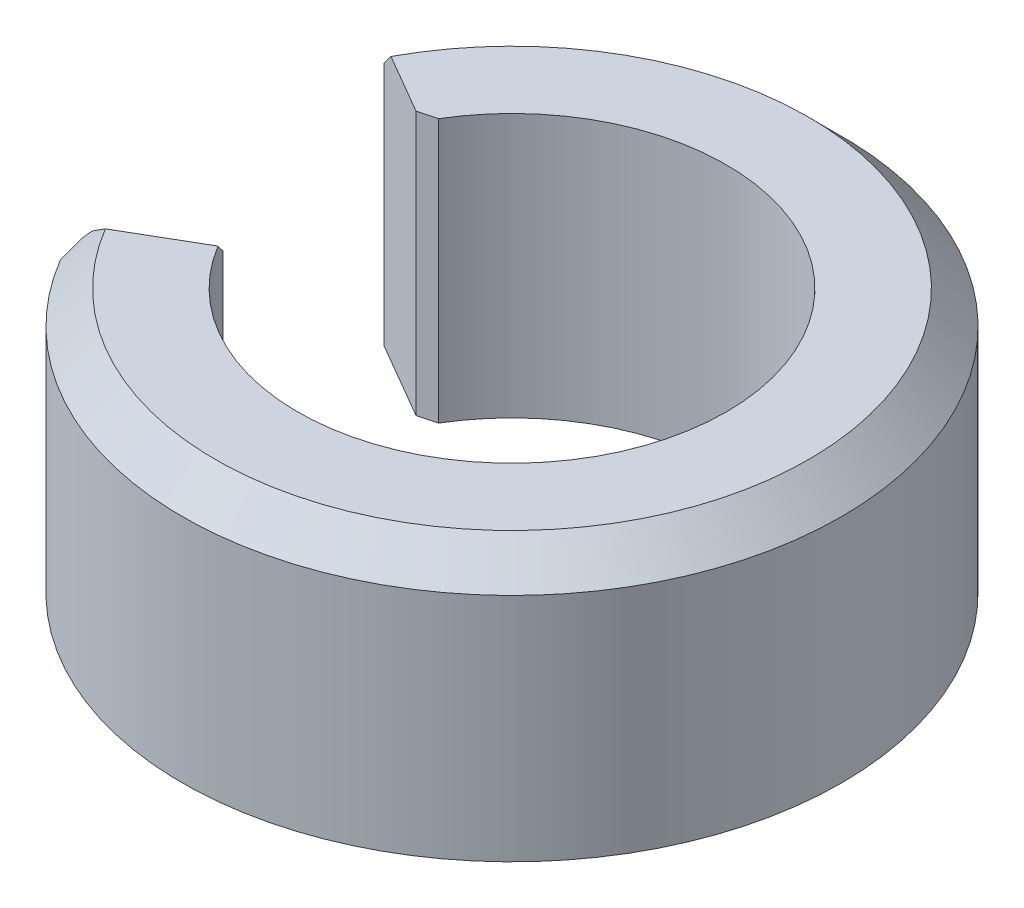
ISO-10303-21;
HEADER;
FILE_DESCRIPTION(('STEP AP214'),'2;1');
FILE_NAME('part.step','',(''),(''),'','','');
FILE_SCHEMA(('AUTOMOTIVE_DESIGN { 1 0 10303 214 1 1 1 1 }'));
ENDSEC;
DATA;
#1=APPLICATION_CONTEXT('core data for automotive mechanical design processes');
#2=APPLICATION_PROTOCOL_DEFINITION('international standard','automotive_design',2000,#1);
#3=PRODUCT_CONTEXT('',#1,'mechanical');
#4=PRODUCT('Part','Part','',(#3));
#5=PRODUCT_RELATED_PRODUCT_CATEGORY('part','',(#4));
#6=PRODUCT_DEFINITION_FORMATION('','',#4);
#7=PRODUCT_DEFINITION_CONTEXT('part definition',#1,'design');
#8=PRODUCT_DEFINITION('design','',#6,#7);
#9=PRODUCT_DEFINITION_SHAPE('','',#8);
#10=(LENGTH_UNIT() NAMED_UNIT(*) SI_UNIT(.MILLI.,.METRE.));
#11=(NAMED_UNIT(*) PLANE_ANGLE_UNIT() SI_UNIT($,.RADIAN.));
#12=(NAMED_UNIT(*) SI_UNIT($,.STERADIAN.) SOLID_ANGLE_UNIT());
#13=UNCERTAINTY_MEASURE_WITH_UNIT(LENGTH_MEASURE(1.E-05),#10,'distance_accuracy_value','');
#14=(GEOMETRIC_REPRESENTATION_CONTEXT(3) GLOBAL_UNCERTAINTY_ASSIGNED_CONTEXT((#13)) GLOBAL_UNIT_ASSIGNED_CONTEXT((#10,
#11,#12)) REPRESENTATION_CONTEXT('',''));
#15=CARTESIAN_POINT('',(0.,0.,0.));
#16=DIRECTION('',(0.,0.,1.));
#17=DIRECTION('',(1.,0.,0.));
#18=AXIS2_PLACEMENT_3D('',#15,#16,#17);
#19=CARTESIAN_POINT('',(0.,4.,0.));
#20=DIRECTION('',(0.,-1.,0.));
#21=DIRECTION('',(0.,0.,-1.));
#22=AXIS2_PLACEMENT_3D('',#19,#20,#21);
#23=CYLINDRICAL_SURFACE('',#22,3.25);
#24=DIRECTION('',(0.,-1.,0.));
#25=VECTOR('',#24,1.);
#26=CARTESIAN_POINT('',(-2.8831406486677,4.,1.5));
#27=LINE('',#26,#25);
#28=CARTESIAN_POINT('',(-2.8831406486677,3.8,1.5));
#29=VERTEX_POINT('',#28);
#30=CARTESIAN_POINT('',(-2.8831406486677,0.,1.5));
#31=VERTEX_POINT('',#30);
#32=EDGE_CURVE('E120',#29,#31,#27,.T.);
#33=ORIENTED_EDGE('',*,*,#32,.F.);
#34=CARTESIAN_POINT('',(0.,3.9513832198583,0.));
#35=DIRECTION('',(0.355221508707248,-0.707106781186547,0.611406313143516));
#36=DIRECTION('',(-0.355221508707247,-0.707106781186548,-0.611406313143515));
#37=AXIS2_PLACEMENT_3D('',#34,#35,#36);
#38=ELLIPSE('',#37,4.59619407771256,3.25);
#39=CARTESIAN_POINT('',(-2.78540456174295,4.,1.67452125320091));
#40=VERTEX_POINT('',#39);
#41=EDGE_CURVE('E157',#29,#40,#38,.F.);
#42=ORIENTED_EDGE('',*,*,#41,.T.);
#43=CARTESIAN_POINT('',(0.,4.,0.));
#44=DIRECTION('',(0.,1.,0.));
#45=DIRECTION('',(0.,0.,1.));
#46=AXIS2_PLACEMENT_3D('',#43,#44,#45);
#47=CIRCLE('',#46,3.25);
#48=CARTESIAN_POINT('',(-2.7870574838442,4.,-1.67176869863867));
#49=VERTEX_POINT('',#48);
#50=EDGE_CURVE('E152',#40,#49,#47,.T.);
#51=ORIENTED_EDGE('',*,*,#50,.T.);
#52=DIRECTION('',(0.,-1.,0.));
#53=VECTOR('',#52,1.);
#54=CARTESIAN_POINT('',(-2.7870574838442,4.,-1.67176869863867));
#55=LINE('',#54,#53);
#56=CARTESIAN_POINT('',(-2.7870574838442,0.,-1.67176869863867));
#57=VERTEX_POINT('',#56);
#58=EDGE_CURVE('E143',#49,#57,#55,.T.);
#59=ORIENTED_EDGE('',*,*,#58,.T.);
#60=CARTESIAN_POINT('',(0.,0.,0.));
#61=DIRECTION('',(0.,1.,0.));
#62=DIRECTION('',(0.,0.,1.));
#63=AXIS2_PLACEMENT_3D('',#60,#61,#62);
#64=CIRCLE('',#63,3.25);
#65=EDGE_CURVE('E135',#31,#57,#64,.T.);
#66=ORIENTED_EDGE('',*,*,#65,.F.);
#67=EDGE_LOOP('',(#33,#42,#51,#59,#66));
#68=FACE_BOUND('',#67,.T.);
#69=ADVANCED_FACE('F43',(#68),#23,.F.);
#70=CARTESIAN_POINT('',(-0.076048734337961,4.,-0.130894878663227));
#71=DIRECTION('',(-0.502359075260422,0.,-0.864659100168092));
#72=DIRECTION('',(-0.864659100168091,0.,0.502359075260422));
#73=AXIS2_PLACEMENT_3D('',#70,#71,#72);
#74=PLANE('',#73);
#75=DIRECTION('',(0.,1.,0.));
#76=VECTOR('',#75,1.);
#77=CARTESIAN_POINT('',(-4.22443043201248,4.,2.27927716840816));
#78=LINE('',#77,#76);
#79=CARTESIAN_POINT('',(-4.22443043201248,0.,2.27927716840816));
#80=VERTEX_POINT('',#79);
#81=CARTESIAN_POINT('',(-4.22443043201248,3.69990449206061,2.27927716840816));
#82=VERTEX_POINT('',#81);
#83=EDGE_CURVE('E128',#80,#82,#78,.T.);
#84=ORIENTED_EDGE('',*,*,#83,.T.);
#85=CARTESIAN_POINT('',(-4.22443043201248,3.69990449206061,2.27927716840816));
#86=CARTESIAN_POINT('',(-4.20999842873637,3.71658716612793,2.27089230572813));
#87=CARTESIAN_POINT('',(-4.19556638682498,3.73326979548987,2.26250742060137));
#88=CARTESIAN_POINT('',(-4.16670222573165,3.766634964803,2.24573760545434));
#89=CARTESIAN_POINT('',(-4.15227010654972,3.78331750475419,2.23735267543409));
#90=CARTESIAN_POINT('',(-4.13783794873251,3.8,2.22896772296709));
#91=B_SPLINE_CURVE_WITH_KNOTS('',3,(#85,#86,#87,#88,#89,#90),.UNSPECIFIED.,.F.,.F.,(4,2,4),(0.,
0.0707962025305125,0.141592405061035),.UNSPECIFIED.);
#92=CARTESIAN_POINT('',(-4.13783794873251,3.8,2.22896772296709));
#93=VERTEX_POINT('',#92);
#94=EDGE_CURVE('E58',#82,#93,#91,.T.);
#95=ORIENTED_EDGE('',*,*,#94,.T.);
#96=DIRECTION('',(0.864659100168091,0.,-0.502359075260422));
#97=VECTOR('',#96,1.);
#98=CARTESIAN_POINT('',(-0.076048734337961,3.8,-0.130894878663227));
#99=LINE('',#98,#97);
#100=EDGE_CURVE('E124',#93,#29,#99,.T.);
#101=ORIENTED_EDGE('',*,*,#100,.T.);
#102=ORIENTED_EDGE('',*,*,#32,.T.);
#103=DIRECTION('',(0.864659100168091,0.,-0.502359075260422));
#104=VECTOR('',#103,1.);
#105=CARTESIAN_POINT('',(-0.076048734337961,0.,-0.130894878663227));
#106=LINE('',#105,#104);
#107=EDGE_CURVE('E123',#80,#31,#106,.T.);
#108=ORIENTED_EDGE('',*,*,#107,.F.);
#109=EDGE_LOOP('',(#84,#95,#101,#102,#108));
#110=FACE_BOUND('',#109,.T.);
#111=ADVANCED_FACE('F122',(#110),#74,.T.);
#112=CARTESIAN_POINT('',(0.,4.,0.));
#113=DIRECTION('',(0.,-1.,0.));
#114=DIRECTION('',(0.,0.,-1.));
#115=AXIS2_PLACEMENT_3D('',#112,#113,#114);
#116=CYLINDRICAL_SURFACE('',#115,5.);
#117=DIRECTION('',(0.,-1.,0.));
#118=VECTOR('',#117,1.);
#119=CARTESIAN_POINT('',(-4.30061913286326,4.,-2.55042644944928));
#120=LINE('',#119,#118);
#121=CARTESIAN_POINT('',(-4.30061913286326,0.,-2.55042644944928));
#122=VERTEX_POINT('',#121);
#123=CARTESIAN_POINT('',(-4.30061913286326,3.49999999999999,-2.55042644944928));
#124=VERTEX_POINT('',#123);
#125=EDGE_CURVE('E164',#122,#124,#120,.F.);
#126=ORIENTED_EDGE('',*,*,#125,.T.);
#127=CARTESIAN_POINT('',(0.,3.49999999999999,0.));
#128=DIRECTION('',(0.,1.,0.));
#129=DIRECTION('',(0.,0.,1.));
#130=AXIS2_PLACEMENT_3D('',#127,#128,#129);
#131=CIRCLE('',#130,5.);
#132=CARTESIAN_POINT('',(-4.29762794941674,3.49999999999999,2.55546356037258));
#133=VERTEX_POINT('',#132);
#134=EDGE_CURVE('E221',#124,#133,#131,.F.);
#135=ORIENTED_EDGE('',*,*,#134,.T.);
#136=DIRECTION('',(0.,-1.,0.));
#137=VECTOR('',#136,1.);
#138=CARTESIAN_POINT('',(-4.29762794941674,4.,2.55546356037258));
#139=LINE('',#138,#137);
#140=CARTESIAN_POINT('',(-4.29762794941674,0.,2.55546356037258));
#141=VERTEX_POINT('',#140);
#142=EDGE_CURVE('E167',#133,#141,#139,.T.);
#143=ORIENTED_EDGE('',*,*,#142,.T.);
#144=CARTESIAN_POINT('',(0.,0.,0.));
#145=DIRECTION('',(0.,1.,0.));
#146=DIRECTION('',(0.,0.,1.));
#147=AXIS2_PLACEMENT_3D('',#144,#145,#146);
#148=CIRCLE('',#147,5.);
#149=EDGE_CURVE('E138',#141,#122,#148,.T.);
#150=ORIENTED_EDGE('',*,*,#149,.T.);
#151=EDGE_LOOP('',(#126,#135,#143,#150));
#152=FACE_BOUND('',#151,.T.);
#153=ADVANCED_FACE('F202',(#152),#116,.T.);
#154=CARTESIAN_POINT('',(-0.0760487343379624,4.,0.130894878663229));
#155=DIRECTION('',(0.502359075260422,0.,-0.864659100168091));
#156=DIRECTION('',(-0.864659100168091,0.,-0.502359075260422));
#157=AXIS2_PLACEMENT_3D('',#154,#155,#156);
#158=PLANE('',#157);
#159=DIRECTION('',(0.864659100168091,0.,0.502359075260422));
#160=VECTOR('',#159,1.);
#161=CARTESIAN_POINT('',(-0.0760487343379624,4.,0.130894878663229));
#162=LINE('',#161,#160);
#163=CARTESIAN_POINT('',(-3.96481236313895,4.,-2.12844143097725));
#164=VERTEX_POINT('',#163);
#165=CARTESIAN_POINT('',(-3.05607246870132,4.,-1.60047181505208));
#166=VERTEX_POINT('',#165);
#167=EDGE_CURVE('E129',#164,#166,#162,.T.);
#168=ORIENTED_EDGE('',*,*,#167,.F.);
#169=CARTESIAN_POINT('',(-3.96481236313895,4.,-2.12844143097725));
#170=CARTESIAN_POINT('',(-4.00716881715181,3.95104136839675,-2.15305014563147));
#171=CARTESIAN_POINT('',(-4.04952491541295,3.90208232513896,-2.17765865359717));
#172=CARTESIAN_POINT('',(-4.13423640043159,3.80416341531452,-2.22687525615143));
#173=CARTESIAN_POINT('',(-4.17659178718909,3.75520354874788,-2.25148335073999));
#174=CARTESIAN_POINT('',(-4.21894681819486,3.7062432705267,-2.27609123864004));
#175=B_SPLINE_CURVE_WITH_KNOTS('',3,(#169,#170,#171,#172,#173,#174),.UNSPECIFIED.,.F.,.F.,(4,2,
4),(0.,0.207772593881651,0.415545187762374),.UNSPECIFIED.);
#176=CARTESIAN_POINT('',(-4.21894681819486,3.7062432705267,-2.27609123864004));
#177=VERTEX_POINT('',#176);
#178=EDGE_CURVE('E182',#164,#177,#175,.T.);
#179=ORIENTED_EDGE('',*,*,#178,.T.);
#180=DIRECTION('',(0.,-1.,0.));
#181=VECTOR('',#180,1.);
#182=CARTESIAN_POINT('',(-4.21894681819486,4.,-2.27609123864004));
#183=LINE('',#182,#181);
#184=CARTESIAN_POINT('',(-4.21894681819486,0.,-2.27609123864004));
#185=VERTEX_POINT('',#184);
#186=EDGE_CURVE('E177',#177,#185,#183,.T.);
#187=ORIENTED_EDGE('',*,*,#186,.T.);
#188=DIRECTION('',(0.864659100168091,0.,0.502359075260422));
#189=VECTOR('',#188,1.);
#190=CARTESIAN_POINT('',(-0.0760487343379624,0.,0.130894878663229));
#191=LINE('',#190,#189);
#192=CARTESIAN_POINT('',(-3.05607246870132,0.,-1.60047181505208));
#193=VERTEX_POINT('',#192);
#194=EDGE_CURVE('E150',#185,#193,#191,.T.);
#195=ORIENTED_EDGE('',*,*,#194,.T.);
#196=DIRECTION('',(0.,1.,0.));
#197=VECTOR('',#196,1.);
#198=CARTESIAN_POINT('',(-3.05607246870132,4.,-1.60047181505208));
#199=LINE('',#198,#197);
#200=EDGE_CURVE('E174',#193,#166,#199,.T.);
#201=ORIENTED_EDGE('',*,*,#200,.T.);
#202=EDGE_LOOP('',(#168,#179,#187,#195,#201));
#203=FACE_BOUND('',#202,.T.);
#204=ADVANCED_FACE('F196',(#203),#158,.F.);
#205=CARTESIAN_POINT('',(0.,4.,0.));
#206=DIRECTION('',(0.,1.,0.));
#207=DIRECTION('',(0.,0.,1.));
#208=AXIS2_PLACEMENT_3D('',#205,#206,#207);
#209=PLANE('',#208);
#210=DIRECTION('',(-0.864659100168091,0.,0.502359075260422));
#211=VECTOR('',#210,1.);
#212=CARTESIAN_POINT('',(0.0244230807141226,4.,0.0420369413703904));
#213=LINE('',#212,#211);
#214=CARTESIAN_POINT('',(-3.86631578555613,4.,2.30252084602061));
#215=VERTEX_POINT('',#214);
#216=EDGE_CURVE('E161',#40,#215,#213,.T.);
#217=ORIENTED_EDGE('',*,*,#216,.T.);
#218=CARTESIAN_POINT('',(0.,4.,0.));
#219=DIRECTION('',(0.,1.,0.));
#220=DIRECTION('',(0.,0.,1.));
#221=AXIS2_PLACEMENT_3D('',#218,#219,#220);
#222=CIRCLE('',#221,4.5);
#223=EDGE_CURVE('E179',#215,#164,#222,.T.);
#224=ORIENTED_EDGE('',*,*,#223,.T.);
#225=ORIENTED_EDGE('',*,*,#167,.T.);
#226=DIRECTION('',(-0.966627821850764,0.,0.256184804436265));
#227=VECTOR('',#226,1.);
#228=CARTESIAN_POINT('',(-0.59690544816138,4.,-2.25222340753873));
#229=LINE('',#228,#227);
#230=EDGE_CURVE('E159',#166,#49,#229,.F.);
#231=ORIENTED_EDGE('',*,*,#230,.T.);
#232=ORIENTED_EDGE('',*,*,#50,.F.);
#233=EDGE_LOOP('',(#217,#224,#225,#231,#232));
#234=FACE_BOUND('',#233,.T.);
#235=ADVANCED_FACE('F201',(#234),#209,.T.);
#236=CARTESIAN_POINT('',(0.,0.,0.));
#237=DIRECTION('',(0.,1.,0.));
#238=DIRECTION('',(0.,0.,1.));
#239=AXIS2_PLACEMENT_3D('',#236,#237,#238);
#240=PLANE('',#239);
#241=ORIENTED_EDGE('',*,*,#149,.F.);
#242=DIRECTION('',(-0.256184804436268,0.,0.966627821850763));
#243=VECTOR('',#242,1.);
#244=CARTESIAN_POINT('',(-4.29762794941674,0.,2.55546356037258));
#245=LINE('',#244,#243);
#246=EDGE_CURVE('E137',#141,#80,#245,.F.);
#247=ORIENTED_EDGE('',*,*,#246,.T.);
#248=ORIENTED_EDGE('',*,*,#107,.T.);
#249=ORIENTED_EDGE('',*,*,#65,.T.);
#250=DIRECTION('',(0.966627821850764,0.,-0.256184804436265));
#251=VECTOR('',#250,1.);
#252=CARTESIAN_POINT('',(-2.7870574838442,0.,-1.67176869863867));
#253=LINE('',#252,#251);
#254=EDGE_CURVE('E169',#57,#193,#253,.F.);
#255=ORIENTED_EDGE('',*,*,#254,.T.);
#256=ORIENTED_EDGE('',*,*,#194,.F.);
#257=DIRECTION('',(0.2853336048058,0.,0.958428262296416));
#258=VECTOR('',#257,1.);
#259=CARTESIAN_POINT('',(-4.21894681819486,0.,-2.27609123864004));
#260=LINE('',#259,#258);
#261=EDGE_CURVE('E171',#185,#122,#260,.F.);
#262=ORIENTED_EDGE('',*,*,#261,.T.);
#263=EDGE_LOOP('',(#241,#247,#248,#249,#255,#256,#262));
#264=FACE_BOUND('',#263,.T.);
#265=ADVANCED_FACE('F134',(#264),#240,.F.);
#266=CARTESIAN_POINT('',(-4.29762794941674,4.,2.55546356037258));
#267=DIRECTION('',(0.966627821850763,0.,0.256184804436268));
#268=DIRECTION('',(0.,-1.,0.));
#269=AXIS2_PLACEMENT_3D('',#266,#267,#268);
#270=PLANE('',#269);
#271=ORIENTED_EDGE('',*,*,#142,.F.);
#272=CARTESIAN_POINT('',(-4.29762794941674,3.49999999999999,2.55546356037258));
#273=CARTESIAN_POINT('',(-4.28551365876637,3.53379323950022,2.50975432945076));
#274=CARTESIAN_POINT('',(-4.2733567234524,3.5673485585592,2.46388419312954));
#275=CARTESIAN_POINT('',(-4.24895755107119,3.63398338973075,2.37182206280252));
#276=CARTESIAN_POINT('',(-4.23671531391707,3.66706290135864,2.32563006846894));
#277=CARTESIAN_POINT('',(-4.22443043201248,3.69990449206061,2.27927716840816));
#278=B_SPLINE_CURVE_WITH_KNOTS('',3,(#272,#273,#274,#275,#276,#277),.UNSPECIFIED.,.F.,.F.,(4,2,
4),(0.,0.174357045385462,0.348714268365537),.UNSPECIFIED.);
#279=EDGE_CURVE('E72',#133,#82,#278,.T.);
#280=ORIENTED_EDGE('',*,*,#279,.T.);
#281=ORIENTED_EDGE('',*,*,#83,.F.);
#282=ORIENTED_EDGE('',*,*,#246,.F.);
#283=EDGE_LOOP('',(#271,#280,#281,#282));
#284=FACE_BOUND('',#283,.T.);
#285=ADVANCED_FACE('F223',(#284),#270,.F.);
#286=CARTESIAN_POINT('',(-0.076048734337961,3.8,-0.130894878663227));
#287=DIRECTION('',(0.355221508707248,-0.707106781186547,0.611406313143516));
#288=DIRECTION('',(0.864659100168091,0.,-0.502359075260422));
#289=AXIS2_PLACEMENT_3D('',#286,#287,#288);
#290=PLANE('',#289);
#291=ORIENTED_EDGE('',*,*,#100,.F.);
#292=CARTESIAN_POINT('',(-4.13783794873251,3.8,2.22896772296709));
#293=CARTESIAN_POINT('',(-4.09287771169015,3.83356881744319,2.24166941585041));
#294=CARTESIAN_POINT('',(-4.04777075886973,3.86701988365204,2.25414968593612));
#295=CARTESIAN_POINT('',(-3.9572633714698,3.93368655057997,2.27866739411191));
#296=CARTESIAN_POINT('',(-3.91186293656475,3.96690215103779,2.2907048317107));
#297=CARTESIAN_POINT('',(-3.86631578555613,4.,2.30252084602061));
#298=B_SPLINE_CURVE_WITH_KNOTS('',3,(#292,#293,#294,#295,#296,#297),.UNSPECIFIED.,.F.,.F.,(4,2,
4),(0.,0.172581324256067,0.345162839968405),.UNSPECIFIED.);
#299=EDGE_CURVE('E11',#93,#215,#298,.T.);
#300=ORIENTED_EDGE('',*,*,#299,.T.);
#301=ORIENTED_EDGE('',*,*,#216,.F.);
#302=ORIENTED_EDGE('',*,*,#41,.F.);
#303=EDGE_LOOP('',(#291,#300,#301,#302));
#304=FACE_BOUND('',#303,.T.);
#305=ADVANCED_FACE('F229',(#304),#290,.F.);
#306=CARTESIAN_POINT('',(-4.21894681819486,4.,-2.27609123864004));
#307=DIRECTION('',(0.958428262296416,0.,-0.2853336048058));
#308=DIRECTION('',(0.,-1.,0.));
#309=AXIS2_PLACEMENT_3D('',#306,#307,#308);
#310=PLANE('',#309);
#311=ORIENTED_EDGE('',*,*,#186,.F.);
#312=CARTESIAN_POINT('',(-4.21894681819486,3.7062432705267,-2.27609123864004));
#313=CARTESIAN_POINT('',(-4.23264960450932,3.67231067192011,-2.32211854651679));
#314=CARTESIAN_POINT('',(-4.24630702693512,3.63815742556277,-2.36799347825475));
#315=CARTESIAN_POINT('',(-4.27353113174283,3.56940966832286,-2.45943854824986));
#316=CARTESIAN_POINT('',(-4.28709781420649,3.53481515783796,-2.50500868678166));
#317=CARTESIAN_POINT('',(-4.30061913286326,3.49999999999999,-2.55042644944928));
#318=B_SPLINE_CURVE_WITH_KNOTS('',3,(#312,#313,#314,#315,#316,#317),.UNSPECIFIED.,.F.,.F.,(4,2,
4),(0.,0.176400989436612,0.352801819908284),.UNSPECIFIED.);
#319=EDGE_CURVE('E189',#177,#124,#318,.T.);
#320=ORIENTED_EDGE('',*,*,#319,.T.);
#321=ORIENTED_EDGE('',*,*,#125,.F.);
#322=ORIENTED_EDGE('',*,*,#261,.F.);
#323=EDGE_LOOP('',(#311,#320,#321,#322));
#324=FACE_BOUND('',#323,.T.);
#325=ADVANCED_FACE('F232',(#324),#310,.F.);
#326=CARTESIAN_POINT('',(-2.7870574838442,4.,-1.67176869863867));
#327=DIRECTION('',(-0.256184804436265,0.,-0.966627821850764));
#328=DIRECTION('',(0.,-1.,0.));
#329=AXIS2_PLACEMENT_3D('',#326,#327,#328);
#330=PLANE('',#329);
#331=ORIENTED_EDGE('',*,*,#230,.F.);
#332=ORIENTED_EDGE('',*,*,#200,.F.);
#333=ORIENTED_EDGE('',*,*,#254,.F.);
#334=ORIENTED_EDGE('',*,*,#58,.F.);
#335=EDGE_LOOP('',(#331,#332,#333,#334));
#336=FACE_BOUND('',#335,.T.);
#337=ADVANCED_FACE('F238',(#336),#330,.F.);
#338=CARTESIAN_POINT('',(0.,4.,0.));
#339=DIRECTION('',(0.,-1.,0.));
#340=DIRECTION('',(0.,0.,-1.));
#341=AXIS2_PLACEMENT_3D('',#338,#339,#340);
#342=CONICAL_SURFACE('',#341,4.5,0.785398163397445);
#343=ORIENTED_EDGE('',*,*,#279,.F.);
#344=ORIENTED_EDGE('',*,*,#134,.F.);
#345=ORIENTED_EDGE('',*,*,#319,.F.);
#346=ORIENTED_EDGE('',*,*,#178,.F.);
#347=ORIENTED_EDGE('',*,*,#223,.F.);
#348=ORIENTED_EDGE('',*,*,#299,.F.);
#349=ORIENTED_EDGE('',*,*,#94,.F.);
#350=EDGE_LOOP('',(#343,#344,#345,#346,#347,#348,#349));
#351=FACE_BOUND('',#350,.T.);
#352=ADVANCED_FACE('F46',(#351),#342,.T.);
#353=CLOSED_SHELL('',(#69,#111,#153,#204,#235,#265,#285,#305,#325,#337,#352));
#354=MANIFOLD_SOLID_BREP('B2',#353);
#355=ADVANCED_BREP_SHAPE_REPRESENTATION('',(#18,#354),#14);
#356=SHAPE_DEFINITION_REPRESENTATION(#9,#355);
ENDSEC;
END-ISO-10303-21;
